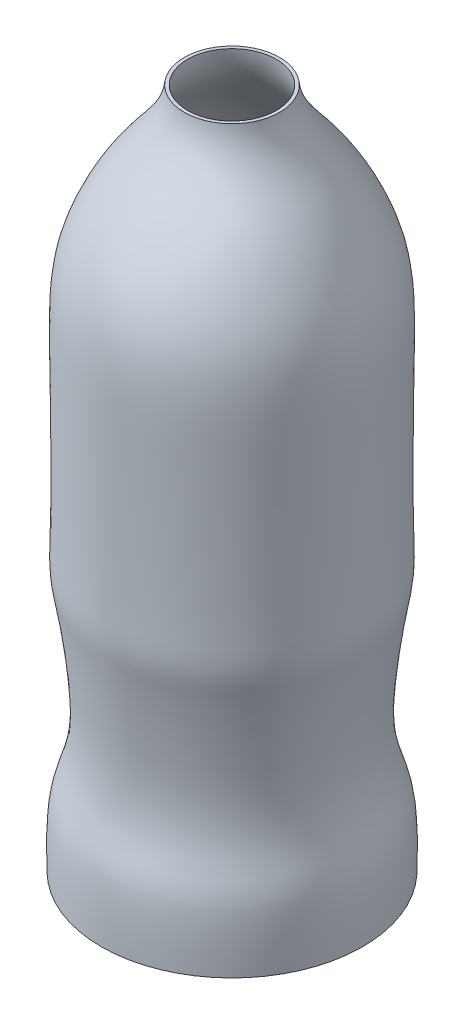
ISO-10303-21;
HEADER;
FILE_DESCRIPTION(('STEP AP214'),'2;1');
FILE_NAME('part.step','',(''),(''),'','','');
FILE_SCHEMA(('AUTOMOTIVE_DESIGN { 1 0 10303 214 1 1 1 1 }'));
ENDSEC;
DATA;
#1=APPLICATION_CONTEXT('core data for automotive mechanical design processes');
#2=APPLICATION_PROTOCOL_DEFINITION('international standard','automotive_design',2000,#1);
#3=PRODUCT_CONTEXT('',#1,'mechanical');
#4=PRODUCT('Part','Part','',(#3));
#5=PRODUCT_RELATED_PRODUCT_CATEGORY('part','',(#4));
#6=PRODUCT_DEFINITION_FORMATION('','',#4);
#7=PRODUCT_DEFINITION_CONTEXT('part definition',#1,'design');
#8=PRODUCT_DEFINITION('design','',#6,#7);
#9=PRODUCT_DEFINITION_SHAPE('','',#8);
#10=(LENGTH_UNIT() NAMED_UNIT(*) SI_UNIT(.MILLI.,.METRE.));
#11=(NAMED_UNIT(*) PLANE_ANGLE_UNIT() SI_UNIT($,.RADIAN.));
#12=(NAMED_UNIT(*) SI_UNIT($,.STERADIAN.) SOLID_ANGLE_UNIT());
#13=UNCERTAINTY_MEASURE_WITH_UNIT(LENGTH_MEASURE(1.E-05),#10,'distance_accuracy_value','');
#14=(GEOMETRIC_REPRESENTATION_CONTEXT(3) GLOBAL_UNCERTAINTY_ASSIGNED_CONTEXT((#13)) GLOBAL_UNIT_ASSIGNED_CONTEXT((#10,
#11,#12)) REPRESENTATION_CONTEXT('',''));
#15=CARTESIAN_POINT('',(0.,0.,0.));
#16=DIRECTION('',(0.,0.,1.));
#17=DIRECTION('',(1.,0.,0.));
#18=AXIS2_PLACEMENT_3D('',#15,#16,#17);
#19=CARTESIAN_POINT('',(-21.9271167685503,3.56862644601761,0.));
#20=CARTESIAN_POINT('',(-22.0512083755422,2.37908429734508,0.));
#21=CARTESIAN_POINT('',(-22.1752999825341,1.18954214867254,0.));
#22=CARTESIAN_POINT('',(-22.299391589526,0.,0.));
#23=CARTESIAN_POINT('',(-23.6734654463071,-13.1718720359327,0.));
#24=CARTESIAN_POINT('',(-38.1992489686414,-26.8534553147253,0.));
#25=CARTESIAN_POINT('',(-51.5365779721397,-49.5694933657187,0.));
#26=CARTESIAN_POINT('',(-59.4784432600971,-70.4369482018264,0.));
#27=CARTESIAN_POINT('',(-60.7083842041813,-91.4634365453902,0.));
#28=CARTESIAN_POINT('',(-60.1810183196323,-119.059331741027,0.));
#29=CARTESIAN_POINT('',(-59.9707479182165,-149.003460037104,0.));
#30=CARTESIAN_POINT('',(-59.9638518842182,-177.894514606332,0.));
#31=CARTESIAN_POINT('',(-60.6754314935296,-196.272451827163,0.));
#32=CARTESIAN_POINT('',(-58.4434415667357,-207.87993913961,0.));
#33=CARTESIAN_POINT('',(-56.3836026033336,-220.85297149261,0.));
#34=CARTESIAN_POINT('',(-54.4554759225268,-236.654824770611,0.));
#35=CARTESIAN_POINT('',(-52.9650128897679,-255.200113738235,0.));
#36=CARTESIAN_POINT('',(-54.7344001914681,-272.692329899648,0.));
#37=CARTESIAN_POINT('',(-60.1620622792334,-286.41656757032,0.));
#38=CARTESIAN_POINT('',(-61.5604419353966,-301.719267440606,0.));
#39=CARTESIAN_POINT('',(-61.43605658108,-311.787696674342,0.));
#40=CARTESIAN_POINT('',(-61.2487762218566,-318.912178790781,0.));
#41=CARTESIAN_POINT('',(-61.2199137704941,-320.010158415667,0.));
#42=CARTESIAN_POINT('',(-61.1910513191317,-321.108138040552,0.));
#43=CARTESIAN_POINT('',(-61.1621888677692,-322.206117665438,0.));
#44=B_SPLINE_CURVE_WITH_KNOTS('',3,(#19,#20,#21,#22,#23,#24,#25,#26,#27,#28,#29,#30,#31,#32,#33,
#34,#35,#36,#37,#38,#39,#40,#41,#42,#43),.UNSPECIFIED.,.F.,.F.,(4,3,1,1,1,1,1,1,1,1,1,1,1,1,1,1,
1,3,4),(-0.01,0.,0.110730603792659,0.177141869029483,0.238949997219122,0.311971060629122,
0.366891112313072,0.490681169918325,0.584226312515668,0.630484562159196,0.657188241052235,
0.691530968581393,0.750153699896334,0.802057134135033,0.860802910636231,0.9082955420332,
0.935112802141643,1.,1.01),.UNSPECIFIED.);
#45=CARTESIAN_POINT('',(0.,0.,0.));
#46=DIRECTION('',(0.,1.,0.));
#47=AXIS1_PLACEMENT('',#45,#46);
#48=SURFACE_OF_REVOLUTION('',#44,#47);
#49=CARTESIAN_POINT('',(0.,-318.912178790781,0.));
#50=DIRECTION('',(0.,1.,0.));
#51=DIRECTION('',(0.,0.,1.));
#52=AXIS2_PLACEMENT_3D('',#49,#50,#51);
#53=CIRCLE('',#52,61.2487762218566);
#54=CARTESIAN_POINT('',(0.,-318.912178790781,61.2487762218566));
#55=VERTEX_POINT('',#54);
#56=EDGE_CURVE('E10',#55,#55,#53,.T.);
#57=ORIENTED_EDGE('',*,*,#56,.T.);
#58=EDGE_LOOP('',(#57));
#59=FACE_BOUND('',#58,.T.);
#60=CARTESIAN_POINT('',(0.,0.,0.));
#61=DIRECTION('',(0.,1.,0.));
#62=DIRECTION('',(0.,0.,1.));
#63=AXIS2_PLACEMENT_3D('',#60,#61,#62);
#64=CIRCLE('',#63,22.299391589526);
#65=CARTESIAN_POINT('',(0.,0.,22.299391589526));
#66=VERTEX_POINT('',#65);
#67=EDGE_CURVE('E46',#66,#66,#64,.T.);
#68=ORIENTED_EDGE('',*,*,#67,.F.);
#69=EDGE_LOOP('',(#68));
#70=FACE_BOUND('',#69,.T.);
#71=ADVANCED_FACE('F39',(#59,#70),#48,.F.);
#72=CARTESIAN_POINT('',(0.,-318.912178790781,0.));
#73=DIRECTION('',(0.,-1.,0.));
#74=DIRECTION('',(0.,0.,-1.));
#75=AXIS2_PLACEMENT_3D('',#72,#73,#74);
#76=PLANE('',#75);
#77=CARTESIAN_POINT('',(0.,-318.912178790781,0.));
#78=DIRECTION('',(0.,1.,0.));
#79=DIRECTION('',(0.,0.,1.));
#80=AXIS2_PLACEMENT_3D('',#77,#78,#79);
#81=CIRCLE('',#80,59.7482580615696);
#82=CARTESIAN_POINT('',(0.,-318.912178790781,59.7482580615696));
#83=VERTEX_POINT('',#82);
#84=EDGE_CURVE('E50',#83,#83,#81,.T.);
#85=ORIENTED_EDGE('',*,*,#84,.T.);
#86=EDGE_LOOP('',(#85));
#87=FACE_BOUND('',#86,.T.);
#88=ORIENTED_EDGE('',*,*,#56,.F.);
#89=EDGE_LOOP('',(#88));
#90=FACE_BOUND('',#89,.T.);
#91=ADVANCED_FACE('F41',(#87,#90),#76,.T.);
#92=CARTESIAN_POINT('',(-22.299391589526,0.,0.));
#93=DIRECTION('',(0.,1.,0.));
#94=DIRECTION('',(0.,0.,1.));
#95=AXIS2_PLACEMENT_3D('',#92,#93,#94);
#96=PLANE('',#95);
#97=CARTESIAN_POINT('',(0.,0.,0.));
#98=DIRECTION('',(0.,1.,0.));
#99=DIRECTION('',(0.,0.,1.));
#100=AXIS2_PLACEMENT_3D('',#97,#98,#99);
#101=CIRCLE('',#100,20.7912518658644);
#102=CARTESIAN_POINT('',(0.,0.,20.7912518658644));
#103=VERTEX_POINT('',#102);
#104=EDGE_CURVE('E54',#103,#103,#101,.T.);
#105=ORIENTED_EDGE('',*,*,#104,.F.);
#106=EDGE_LOOP('',(#105));
#107=FACE_BOUND('',#106,.T.);
#108=ORIENTED_EDGE('',*,*,#67,.T.);
#109=EDGE_LOOP('',(#108));
#110=FACE_BOUND('',#109,.T.);
#111=ADVANCED_FACE('F69',(#107,#110),#96,.T.);
#112=CARTESIAN_POINT('',(-21.9271167685503,3.56862644601761,0.));
#113=CARTESIAN_POINT('',(-22.0512083755422,2.37908429734508,0.));
#114=CARTESIAN_POINT('',(-22.1752999825341,1.18954214867254,0.));
#115=CARTESIAN_POINT('',(-23.6734654463071,-13.1718720359327,0.));
#116=CARTESIAN_POINT('',(-38.1992489686414,-26.8534553147253,0.));
#117=CARTESIAN_POINT('',(-51.5365779721397,-49.5694933657187,0.));
#118=CARTESIAN_POINT('',(-59.4784432600971,-70.4369482018264,0.));
#119=CARTESIAN_POINT('',(-60.7083842041813,-91.4634365453902,0.));
#120=CARTESIAN_POINT('',(-60.1810183196323,-119.059331741027,0.));
#121=CARTESIAN_POINT('',(-59.9707479182165,-149.003460037104,0.));
#122=CARTESIAN_POINT('',(-59.9638518842182,-177.894514606332,0.));
#123=CARTESIAN_POINT('',(-60.6754314935296,-196.272451827163,0.));
#124=CARTESIAN_POINT('',(-58.4434415667357,-207.87993913961,0.));
#125=CARTESIAN_POINT('',(-56.3836026033336,-220.85297149261,0.));
#126=CARTESIAN_POINT('',(-54.4554759225268,-236.654824770611,0.));
#127=CARTESIAN_POINT('',(-52.9650128897679,-255.200113738235,0.));
#128=CARTESIAN_POINT('',(-54.7344001914681,-272.692329899648,0.));
#129=CARTESIAN_POINT('',(-60.1620622792334,-286.41656757032,0.));
#130=CARTESIAN_POINT('',(-61.5604419353966,-301.719267440606,0.));
#131=CARTESIAN_POINT('',(-61.43605658108,-311.787696674342,0.));
#132=CARTESIAN_POINT('',(-61.2199137704941,-320.010158415667,0.));
#133=CARTESIAN_POINT('',(-61.1910513191317,-321.108138040552,0.));
#134=CARTESIAN_POINT('',(-61.1621888677692,-322.206117665438,0.));
#135=B_SPLINE_CURVE_WITH_KNOTS('',3,(#112,#113,#114,#115,#116,#117,#118,#119,#120,#121,#122,
#123,#124,#125,#126,#127,#128,#129,#130,#131,#132,#133,#134),.UNSPECIFIED.,.F.,.F.,(4,2,1,1,1,1,
1,1,1,1,1,1,1,1,1,1,1,2,4),(-0.01,0.,0.110730603792659,0.177141869029483,0.238949997219122,
0.311971060629122,0.366891112313072,0.490681169918325,0.584226312515668,0.630484562159196,
0.657188241052235,0.691530968581393,0.750153699896334,0.802057134135033,0.860802910636231,
0.9082955420332,0.935112802141643,1.,1.01),.UNSPECIFIED.);
#136=CARTESIAN_POINT('',(0.,0.,0.));
#137=DIRECTION('',(0.,1.,0.));
#138=AXIS1_PLACEMENT('',#136,#137);
#139=SURFACE_OF_REVOLUTION('',#135,#138);
#140=OFFSET_SURFACE('',#139,1.5,.F.);
#141=ORIENTED_EDGE('',*,*,#84,.F.);
#142=EDGE_LOOP('',(#141));
#143=FACE_BOUND('',#142,.T.);
#144=ORIENTED_EDGE('',*,*,#104,.T.);
#145=EDGE_LOOP('',(#144));
#146=FACE_BOUND('',#145,.T.);
#147=ADVANCED_FACE('F68',(#143,#146),#140,.T.);
#148=CLOSED_SHELL('',(#71,#91,#111,#147));
#149=MANIFOLD_SOLID_BREP('B2',#148);
#150=ADVANCED_BREP_SHAPE_REPRESENTATION('',(#18,#149),#14);
#151=SHAPE_DEFINITION_REPRESENTATION(#9,#150);
ENDSEC;
END-ISO-10303-21;
